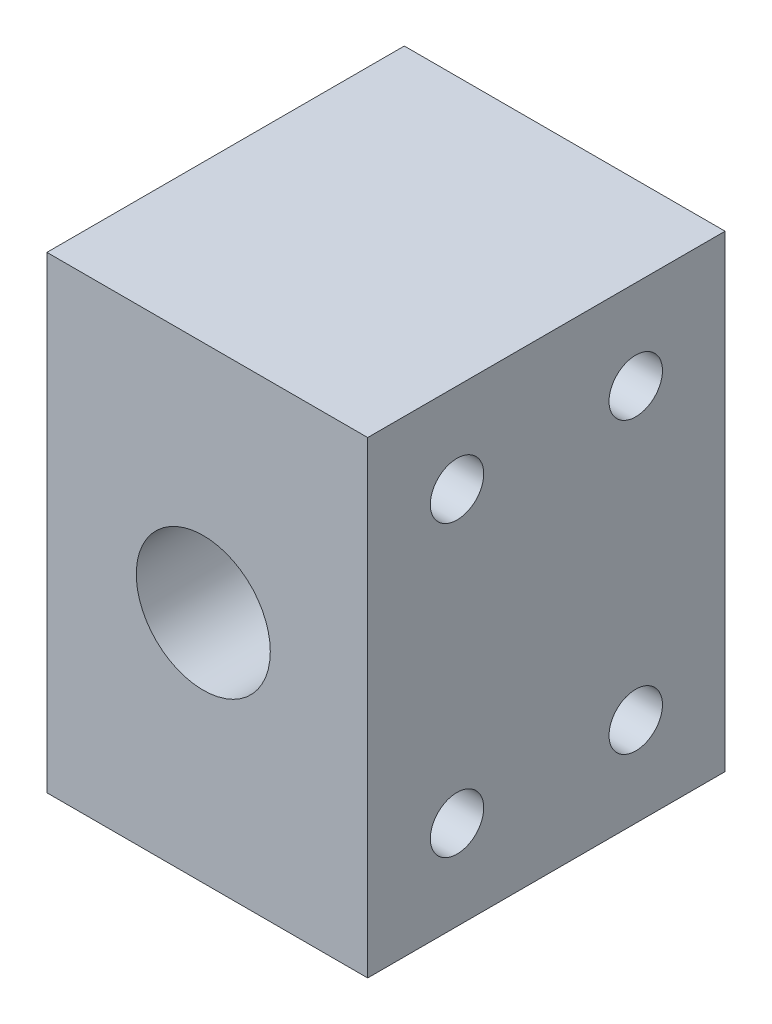
ISO-10303-21;
HEADER;
FILE_DESCRIPTION(('STEP AP214'),'2;1');
FILE_NAME('part.step','',(''),(''),'','','');
FILE_SCHEMA(('AUTOMOTIVE_DESIGN { 1 0 10303 214 1 1 1 1 }'));
ENDSEC;
DATA;
#1=APPLICATION_CONTEXT('core data for automotive mechanical design processes');
#2=APPLICATION_PROTOCOL_DEFINITION('international standard','automotive_design',2000,#1);
#3=PRODUCT_CONTEXT('',#1,'mechanical');
#4=PRODUCT('Part','Part','',(#3));
#5=PRODUCT_RELATED_PRODUCT_CATEGORY('part','',(#4));
#6=PRODUCT_DEFINITION_FORMATION('','',#4);
#7=PRODUCT_DEFINITION_CONTEXT('part definition',#1,'design');
#8=PRODUCT_DEFINITION('design','',#6,#7);
#9=PRODUCT_DEFINITION_SHAPE('','',#8);
#10=(LENGTH_UNIT() NAMED_UNIT(*) SI_UNIT(.MILLI.,.METRE.));
#11=(NAMED_UNIT(*) PLANE_ANGLE_UNIT() SI_UNIT($,.RADIAN.));
#12=(NAMED_UNIT(*) SI_UNIT($,.STERADIAN.) SOLID_ANGLE_UNIT());
#13=UNCERTAINTY_MEASURE_WITH_UNIT(LENGTH_MEASURE(1.E-05),#10,'distance_accuracy_value','');
#14=(GEOMETRIC_REPRESENTATION_CONTEXT(3) GLOBAL_UNCERTAINTY_ASSIGNED_CONTEXT((#13)) GLOBAL_UNIT_ASSIGNED_CONTEXT((#10,
#11,#12)) REPRESENTATION_CONTEXT('',''));
#15=CARTESIAN_POINT('',(0.,0.,0.));
#16=DIRECTION('',(0.,0.,1.));
#17=DIRECTION('',(1.,0.,0.));
#18=AXIS2_PLACEMENT_3D('',#15,#16,#17);
#19=CARTESIAN_POINT('',(0.,0.,25.4));
#20=DIRECTION('',(0.,0.,-1.));
#21=DIRECTION('',(-1.,0.,0.));
#22=AXIS2_PLACEMENT_3D('',#19,#20,#21);
#23=PLANE('',#22);
#24=DIRECTION('',(0.,-1.,0.));
#25=VECTOR('',#24,1.);
#26=CARTESIAN_POINT('',(0.,0.,25.4));
#27=LINE('',#26,#25);
#28=CARTESIAN_POINT('',(0.,33.2637967141949,25.4));
#29=VERTEX_POINT('',#28);
#30=CARTESIAN_POINT('',(0.,0.,25.4));
#31=VERTEX_POINT('',#30);
#32=EDGE_CURVE('E213',#29,#31,#27,.T.);
#33=ORIENTED_EDGE('',*,*,#32,.T.);
#34=DIRECTION('',(1.,0.,0.));
#35=VECTOR('',#34,1.);
#36=CARTESIAN_POINT('',(0.,0.,25.4));
#37=LINE('',#36,#35);
#38=CARTESIAN_POINT('',(22.7965,0.,25.4));
#39=VERTEX_POINT('',#38);
#40=EDGE_CURVE('E86',#31,#39,#37,.T.);
#41=ORIENTED_EDGE('',*,*,#40,.T.);
#42=DIRECTION('',(0.,1.,0.));
#43=VECTOR('',#42,1.);
#44=CARTESIAN_POINT('',(22.7965,0.,25.4));
#45=LINE('',#44,#43);
#46=CARTESIAN_POINT('',(22.7965,33.2637967141949,25.4));
#47=VERTEX_POINT('',#46);
#48=EDGE_CURVE('E209',#39,#47,#45,.T.);
#49=ORIENTED_EDGE('',*,*,#48,.T.);
#50=DIRECTION('',(-1.,0.,0.));
#51=VECTOR('',#50,1.);
#52=CARTESIAN_POINT('',(0.,33.2637967141949,25.4));
#53=LINE('',#52,#51);
#54=EDGE_CURVE('E55',#47,#29,#53,.T.);
#55=ORIENTED_EDGE('',*,*,#54,.T.);
#56=EDGE_LOOP('',(#33,#41,#49,#55));
#57=FACE_BOUND('',#56,.T.);
#58=CARTESIAN_POINT('',(11.1125,16.6318983570974,25.4));
#59=DIRECTION('',(0.,0.,1.));
#60=DIRECTION('',(1.,0.,0.));
#61=AXIS2_PLACEMENT_3D('',#58,#59,#60);
#62=CIRCLE('',#61,4.7625);
#63=CARTESIAN_POINT('',(15.875,16.6318983570974,25.4));
#64=VERTEX_POINT('',#63);
#65=EDGE_CURVE('E143',#64,#64,#62,.T.);
#66=ORIENTED_EDGE('',*,*,#65,.F.);
#67=EDGE_LOOP('',(#66));
#68=FACE_BOUND('',#67,.T.);
#69=ADVANCED_FACE('F38',(#57,#68),#23,.F.);
#70=CARTESIAN_POINT('',(0.,0.,0.));
#71=DIRECTION('',(0.,0.,-1.));
#72=DIRECTION('',(-1.,0.,0.));
#73=AXIS2_PLACEMENT_3D('',#70,#71,#72);
#74=PLANE('',#73);
#75=DIRECTION('',(0.,-1.,0.));
#76=VECTOR('',#75,1.);
#77=CARTESIAN_POINT('',(0.,0.,0.));
#78=LINE('',#77,#76);
#79=CARTESIAN_POINT('',(0.,33.2637967141949,0.));
#80=VERTEX_POINT('',#79);
#81=CARTESIAN_POINT('',(0.,0.,0.));
#82=VERTEX_POINT('',#81);
#83=EDGE_CURVE('E207',#80,#82,#78,.T.);
#84=ORIENTED_EDGE('',*,*,#83,.F.);
#85=DIRECTION('',(-1.,0.,0.));
#86=VECTOR('',#85,1.);
#87=CARTESIAN_POINT('',(0.,33.2637967141949,0.));
#88=LINE('',#87,#86);
#89=CARTESIAN_POINT('',(22.7965,33.2637967141949,0.));
#90=VERTEX_POINT('',#89);
#91=EDGE_CURVE('E79',#90,#80,#88,.T.);
#92=ORIENTED_EDGE('',*,*,#91,.F.);
#93=DIRECTION('',(0.,1.,0.));
#94=VECTOR('',#93,1.);
#95=CARTESIAN_POINT('',(22.7965,0.,0.));
#96=LINE('',#95,#94);
#97=CARTESIAN_POINT('',(22.7965,0.,0.));
#98=VERTEX_POINT('',#97);
#99=EDGE_CURVE('E73',#98,#90,#96,.T.);
#100=ORIENTED_EDGE('',*,*,#99,.F.);
#101=DIRECTION('',(1.,0.,0.));
#102=VECTOR('',#101,1.);
#103=CARTESIAN_POINT('',(0.,0.,0.));
#104=LINE('',#103,#102);
#105=EDGE_CURVE('E202',#82,#98,#104,.T.);
#106=ORIENTED_EDGE('',*,*,#105,.F.);
#107=EDGE_LOOP('',(#84,#92,#100,#106));
#108=FACE_BOUND('',#107,.T.);
#109=CARTESIAN_POINT('',(11.1125,16.6318983570974,0.));
#110=DIRECTION('',(0.,0.,1.));
#111=DIRECTION('',(1.,0.,0.));
#112=AXIS2_PLACEMENT_3D('',#109,#110,#111);
#113=CIRCLE('',#112,4.7625);
#114=CARTESIAN_POINT('',(15.875,16.6318983570974,0.));
#115=VERTEX_POINT('',#114);
#116=EDGE_CURVE('E142',#115,#115,#113,.T.);
#117=ORIENTED_EDGE('',*,*,#116,.T.);
#118=EDGE_LOOP('',(#117));
#119=FACE_BOUND('',#118,.T.);
#120=ADVANCED_FACE('F181',(#108,#119),#74,.T.);
#121=CARTESIAN_POINT('',(0.,0.,25.4));
#122=DIRECTION('',(1.,0.,0.));
#123=DIRECTION('',(0.,0.,-1.));
#124=AXIS2_PLACEMENT_3D('',#121,#122,#123);
#125=PLANE('',#124);
#126=CARTESIAN_POINT('',(0.,16.6318983570974,12.7));
#127=DIRECTION('',(-1.,0.,0.));
#128=DIRECTION('',(0.,0.,1.));
#129=AXIS2_PLACEMENT_3D('',#126,#127,#128);
#130=CIRCLE('',#129,1.89864999999999);
#131=CARTESIAN_POINT('',(0.,16.6318983570974,14.59865));
#132=VERTEX_POINT('',#131);
#133=EDGE_CURVE('E132',#132,#132,#130,.T.);
#134=ORIENTED_EDGE('',*,*,#133,.F.);
#135=EDGE_LOOP('',(#134));
#136=FACE_BOUND('',#135,.T.);
#137=ORIENTED_EDGE('',*,*,#83,.T.);
#138=DIRECTION('',(0.,0.,-1.));
#139=VECTOR('',#138,1.);
#140=CARTESIAN_POINT('',(0.,0.,25.4));
#141=LINE('',#140,#139);
#142=EDGE_CURVE('E11',#31,#82,#141,.T.);
#143=ORIENTED_EDGE('',*,*,#142,.F.);
#144=ORIENTED_EDGE('',*,*,#32,.F.);
#145=DIRECTION('',(0.,0.,-1.));
#146=VECTOR('',#145,1.);
#147=CARTESIAN_POINT('',(0.,33.2637967141949,25.4));
#148=LINE('',#147,#146);
#149=EDGE_CURVE('E217',#29,#80,#148,.T.);
#150=ORIENTED_EDGE('',*,*,#149,.T.);
#151=EDGE_LOOP('',(#137,#143,#144,#150));
#152=FACE_BOUND('',#151,.T.);
#153=ADVANCED_FACE('F40',(#136,#152),#125,.F.);
#154=CARTESIAN_POINT('',(0.,0.,25.4));
#155=DIRECTION('',(0.,1.,0.));
#156=DIRECTION('',(0.,0.,1.));
#157=AXIS2_PLACEMENT_3D('',#154,#155,#156);
#158=PLANE('',#157);
#159=ORIENTED_EDGE('',*,*,#105,.T.);
#160=DIRECTION('',(0.,0.,-1.));
#161=VECTOR('',#160,1.);
#162=CARTESIAN_POINT('',(22.7965,0.,25.4));
#163=LINE('',#162,#161);
#164=EDGE_CURVE('E47',#39,#98,#163,.T.);
#165=ORIENTED_EDGE('',*,*,#164,.F.);
#166=ORIENTED_EDGE('',*,*,#40,.F.);
#167=ORIENTED_EDGE('',*,*,#142,.T.);
#168=EDGE_LOOP('',(#159,#165,#166,#167));
#169=FACE_BOUND('',#168,.T.);
#170=ADVANCED_FACE('F195',(#169),#158,.F.);
#171=CARTESIAN_POINT('',(22.7965,0.,25.4));
#172=DIRECTION('',(-1.,0.,0.));
#173=DIRECTION('',(0.,0.,1.));
#174=AXIS2_PLACEMENT_3D('',#171,#172,#173);
#175=PLANE('',#174);
#176=CARTESIAN_POINT('',(22.7965,26.9137967141949,19.05));
#177=DIRECTION('',(1.,0.,0.));
#178=DIRECTION('',(0.,0.,-1.));
#179=AXIS2_PLACEMENT_3D('',#176,#177,#178);
#180=CIRCLE('',#179,1.89864999999999);
#181=CARTESIAN_POINT('',(22.7965,26.9137967141949,17.15135));
#182=VERTEX_POINT('',#181);
#183=EDGE_CURVE('E110',#182,#182,#180,.T.);
#184=ORIENTED_EDGE('',*,*,#183,.F.);
#185=EDGE_LOOP('',(#184));
#186=FACE_BOUND('',#185,.T.);
#187=CARTESIAN_POINT('',(22.7965,26.9137967141949,6.35));
#188=DIRECTION('',(1.,0.,0.));
#189=DIRECTION('',(0.,0.,-1.));
#190=AXIS2_PLACEMENT_3D('',#187,#188,#189);
#191=CIRCLE('',#190,1.89864999999999);
#192=CARTESIAN_POINT('',(22.7965,26.9137967141949,4.45135000000001));
#193=VERTEX_POINT('',#192);
#194=EDGE_CURVE('E109',#193,#193,#191,.T.);
#195=ORIENTED_EDGE('',*,*,#194,.F.);
#196=EDGE_LOOP('',(#195));
#197=FACE_BOUND('',#196,.T.);
#198=CARTESIAN_POINT('',(22.7965,6.35,19.05));
#199=DIRECTION('',(1.,0.,0.));
#200=DIRECTION('',(0.,0.,-1.));
#201=AXIS2_PLACEMENT_3D('',#198,#199,#200);
#202=CIRCLE('',#201,1.89864999999999);
#203=CARTESIAN_POINT('',(22.7965,6.35,17.15135));
#204=VERTEX_POINT('',#203);
#205=EDGE_CURVE('E120',#204,#204,#202,.T.);
#206=ORIENTED_EDGE('',*,*,#205,.F.);
#207=EDGE_LOOP('',(#206));
#208=FACE_BOUND('',#207,.T.);
#209=CARTESIAN_POINT('',(22.7965,6.35,6.35));
#210=DIRECTION('',(1.,0.,0.));
#211=DIRECTION('',(0.,0.,-1.));
#212=AXIS2_PLACEMENT_3D('',#209,#210,#211);
#213=CIRCLE('',#212,1.89864999999999);
#214=CARTESIAN_POINT('',(22.7965,6.35,4.45135000000001));
#215=VERTEX_POINT('',#214);
#216=EDGE_CURVE('E126',#215,#215,#213,.T.);
#217=ORIENTED_EDGE('',*,*,#216,.F.);
#218=EDGE_LOOP('',(#217));
#219=FACE_BOUND('',#218,.T.);
#220=ORIENTED_EDGE('',*,*,#99,.T.);
#221=DIRECTION('',(0.,0.,-1.));
#222=VECTOR('',#221,1.);
#223=CARTESIAN_POINT('',(22.7965,33.2637967141949,25.4));
#224=LINE('',#223,#222);
#225=EDGE_CURVE('E210',#47,#90,#224,.T.);
#226=ORIENTED_EDGE('',*,*,#225,.F.);
#227=ORIENTED_EDGE('',*,*,#48,.F.);
#228=ORIENTED_EDGE('',*,*,#164,.T.);
#229=EDGE_LOOP('',(#220,#226,#227,#228));
#230=FACE_BOUND('',#229,.T.);
#231=ADVANCED_FACE('F193',(#186,#197,#208,#219,#230),#175,.F.);
#232=CARTESIAN_POINT('',(0.,33.2637967141949,25.4));
#233=DIRECTION('',(0.,-1.,0.));
#234=DIRECTION('',(0.,0.,-1.));
#235=AXIS2_PLACEMENT_3D('',#232,#233,#234);
#236=PLANE('',#235);
#237=ORIENTED_EDGE('',*,*,#91,.T.);
#238=ORIENTED_EDGE('',*,*,#149,.F.);
#239=ORIENTED_EDGE('',*,*,#54,.F.);
#240=ORIENTED_EDGE('',*,*,#225,.T.);
#241=EDGE_LOOP('',(#237,#238,#239,#240));
#242=FACE_BOUND('',#241,.T.);
#243=ADVANCED_FACE('F190',(#242),#236,.F.);
#244=CARTESIAN_POINT('',(11.1125,16.6318983570974,25.4));
#245=DIRECTION('',(0.,0.,-1.));
#246=DIRECTION('',(-1.,0.,0.));
#247=AXIS2_PLACEMENT_3D('',#244,#245,#246);
#248=CYLINDRICAL_SURFACE('',#247,4.7625);
#249=CARTESIAN_POINT('',(6.35,16.6318983570974,14.59865));
#250=CARTESIAN_POINT('',(6.35000679531981,16.5298256242953,14.5986408015354));
#251=CARTESIAN_POINT('',(6.35332001621337,16.4275745138337,14.5903696425024));
#252=CARTESIAN_POINT('',(6.36625011009654,16.2259532275521,14.557571033375));
#253=CARTESIAN_POINT('',(6.37588417054312,16.1265916804909,14.532999257049));
#254=CARTESIAN_POINT('',(6.40041754384473,15.9339902451184,14.4686339296777));
#255=CARTESIAN_POINT('',(6.41529965593297,15.8407315243492,14.4288900712261));
#256=CARTESIAN_POINT('',(6.448861991966,15.6622896967492,14.3355054089604));
#257=CARTESIAN_POINT('',(6.46754088368354,15.5771037726376,14.2818694778398));
#258=CARTESIAN_POINT('',(6.50778518791928,15.4131120845121,14.1595669570853));
#259=CARTESIAN_POINT('',(6.52943979917229,15.3347340860747,14.0903563414016));
#260=CARTESIAN_POINT('',(6.57278635322964,15.1903362203554,13.9400171985775));
#261=CARTESIAN_POINT('',(6.59447830904458,15.1243223640657,13.8588829086145));
#262=CARTESIAN_POINT('',(6.63650775947961,15.0036575936716,13.6826495607817));
#263=CARTESIAN_POINT('',(6.65674319714939,14.9496368979247,13.5870921591106));
#264=CARTESIAN_POINT('',(6.69217036678477,14.8586259112602,13.3873197101917));
#265=CARTESIAN_POINT('',(6.7073644774048,14.8216275854651,13.283108775052));
#266=CARTESIAN_POINT('',(6.73003165090791,14.7674386428951,13.0739013087224));
#267=CARTESIAN_POINT('',(6.73782218978307,14.7494295339974,12.9691524334466));
#268=CARTESIAN_POINT('',(6.74572085877594,14.7311733765464,12.7578520707582));
#269=CARTESIAN_POINT('',(6.7458327321584,14.7309176734028,12.6513014869987));
#270=CARTESIAN_POINT('',(6.73863241832259,14.7475549858169,12.4472669246486));
#271=CARTESIAN_POINT('',(6.73183232461466,14.7632651118477,12.349664916356));
#272=CARTESIAN_POINT('',(6.71243331338369,14.8094167182047,12.1586186469878));
#273=CARTESIAN_POINT('',(6.69983339147169,14.8398607501315,12.065175109133));
#274=CARTESIAN_POINT('',(6.66997853794237,14.9151940988676,11.8828531471995));
#275=CARTESIAN_POINT('',(6.65263415980959,14.9603645623674,11.7941061889284));
#276=CARTESIAN_POINT('',(6.61526953373682,15.0636712420208,11.6251271556913));
#277=CARTESIAN_POINT('',(6.59524828613616,15.1218123074165,11.5448982819314));
#278=CARTESIAN_POINT('',(6.5529142679631,15.2546548298896,11.3887537884854));
#279=CARTESIAN_POINT('',(6.53054355368161,15.3302847574538,11.3136416823149));
#280=CARTESIAN_POINT('',(6.48733833914154,15.4933068099876,11.1769105810361));
#281=CARTESIAN_POINT('',(6.46650414132475,15.5807012411212,11.1152942377032));
#282=CARTESIAN_POINT('',(6.42820370494631,15.7670380167707,11.0062586947868));
#283=CARTESIAN_POINT('',(6.41081109434348,15.8661723733392,10.9591398904283));
#284=CARTESIAN_POINT('',(6.38190957764249,16.071829595602,10.8825240379876));
#285=CARTESIAN_POINT('',(6.37039770370417,16.1783487035344,10.8530180999243));
#286=CARTESIAN_POINT('',(6.35509459044693,16.3890151206166,10.81408618898));
#287=CARTESIAN_POINT('',(6.35088869855197,16.4929328404233,10.8035802746306));
#288=CARTESIAN_POINT('',(6.3493666335719,16.7011213701629,10.7997602362074));
#289=CARTESIAN_POINT('',(6.35204868929388,16.8053920824399,10.8064416925088));
#290=CARTESIAN_POINT('',(6.36372961671543,17.0064441987747,10.836011155892));
#291=CARTESIAN_POINT('',(6.3724416349754,17.1033522732103,10.8581636026108));
#292=CARTESIAN_POINT('',(6.3950092685942,17.2919876754011,10.9170471345811));
#293=CARTESIAN_POINT('',(6.40886554537373,17.3837143352103,10.9537800945575));
#294=CARTESIAN_POINT('',(6.440901706813,17.5625340941767,11.0419795085857));
#295=CARTESIAN_POINT('',(6.45920070075839,17.6494001613374,11.0938616268677));
#296=CARTESIAN_POINT('',(6.49813621814923,17.8134977385189,11.2104250027076));
#297=CARTESIAN_POINT('',(6.51877367340779,17.8907253819496,11.2751113701326));
#298=CARTESIAN_POINT('',(6.56181547138519,18.038666848221,11.4204236447556));
#299=CARTESIAN_POINT('',(6.5842469226184,18.1086212224661,11.5018167290977));
#300=CARTESIAN_POINT('',(6.627092522796,18.2340630202553,11.6755859441581));
#301=CARTESIAN_POINT('',(6.6475063481327,18.2895481253995,11.7679638315147));
#302=CARTESIAN_POINT('',(6.6840298338754,18.3848096556099,11.9624370029683));
#303=CARTESIAN_POINT('',(6.70009744824393,18.4244342914458,12.0646150986014));
#304=CARTESIAN_POINT('',(6.72544249206387,18.4856108545395,12.2750266169471));
#305=CARTESIAN_POINT('',(6.7347248870334,18.5071759996708,12.3832555490069));
#306=CARTESIAN_POINT('',(6.74473376626116,18.530363275985,12.5943516664088));
#307=CARTESIAN_POINT('',(6.74602493696256,18.5333020022708,12.6970483733429));
#308=CARTESIAN_POINT('',(6.74138278671852,18.5226057615673,12.9013982897877));
#309=CARTESIAN_POINT('',(6.73545036950355,18.5089728678247,13.0030516282279));
#310=CARTESIAN_POINT('',(6.71752610835862,18.466593015063,13.1983670801302));
#311=CARTESIAN_POINT('',(6.70577973742014,18.4384565679856,13.2921862378584));
#312=CARTESIAN_POINT('',(6.67772232046415,18.3684375395061,13.4738108906078));
#313=CARTESIAN_POINT('',(6.66141001586846,18.3265511674508,13.5616147192135));
#314=CARTESIAN_POINT('',(6.62490370888163,18.227461386709,13.7341694355925));
#315=CARTESIAN_POINT('',(6.6045414203268,18.1695208494245,13.8184608497514));
#316=CARTESIAN_POINT('',(6.56274611374045,18.0410486557988,13.9765375660417));
#317=CARTESIAN_POINT('',(6.5413127782863,17.9705132506285,14.0503197283356));
#318=CARTESIAN_POINT('',(6.49813559763286,17.8134601949209,14.1901448068558));
#319=CARTESIAN_POINT('',(6.47646020961749,17.7262070599907,14.2553863975172));
#320=CARTESIAN_POINT('',(6.43664972725121,17.5411685620067,14.3703164473622));
#321=CARTESIAN_POINT('',(6.4185162844474,17.4433783185022,14.4199976574974));
#322=CARTESIAN_POINT('',(6.38814218703822,17.2418512614782,14.5012265398066));
#323=CARTESIAN_POINT('',(6.37579736698386,17.1382604190613,14.5330969080432));
#324=CARTESIAN_POINT('',(6.35796411861422,16.9267958846899,14.5787046390349));
#325=CARTESIAN_POINT('',(6.35245391283124,16.8189369319366,14.592499604299));
#326=CARTESIAN_POINT('',(6.35021644508197,16.6845394404929,14.5981051419701));
#327=CARTESIAN_POINT('',(6.34999824735941,16.6582248318231,14.5986523724568));
#328=CARTESIAN_POINT('',(6.35,16.6318983570974,14.59865));
#329=B_SPLINE_CURVE_WITH_KNOTS('',3,(#249,#250,#251,#252,#253,#254,#255,#256,#257,#258,#259,
#260,#261,#262,#263,#264,#265,#266,#267,#268,#269,#270,#271,#272,#273,#274,#275,#276,#277,#278,
#279,#280,#281,#282,#283,#284,#285,#286,#287,#288,#289,#290,#291,#292,#293,#294,#295,#296,#297,
#298,#299,#300,#301,#302,#303,#304,#305,#306,#307,#308,#309,#310,#311,#312,#313,#314,#315,#316,
#317,#318,#319,#320,#321,#322,#323,#324,#325,#326,#327,#328),.UNSPECIFIED.,.T.,.F.,(4,2,2,2,2,2,
2,2,2,2,2,2,2,2,2,2,2,2,2,2,2,2,2,2,2,2,2,2,2,2,2,2,2,2,2,2,2,2,2,4),(0.,0.306148253780946,
0.613132447174014,0.919119694629606,1.22499976097993,1.54394122193961,1.86303734032263,
2.19621911645721,2.52924346279921,2.8472399303701,3.16508137706849,3.46097606376102,
3.75692201149442,4.05888581395965,4.36096269959933,4.68622177111352,5.01154469539098,
5.34321379395449,5.67471534280482,5.98669955955124,6.29860355952906,6.59660670766993,
6.89464818470762,7.20179098568954,7.50905660798068,7.83647522984814,8.16394628156538,
8.4944804083155,8.82477240275464,9.13143057243014,9.43805038057874,9.73270580401241,
10.0274425279509,10.3389833366048,10.6506170295979,10.9822641672415,11.3140655789075,
11.639642486308,11.964179304599,12.0431406887436),.UNSPECIFIED.);
#330=CARTESIAN_POINT('',(6.35,16.6318983570974,14.59865));
#331=VERTEX_POINT('',#330);
#332=EDGE_CURVE('E135',#331,#331,#329,.T.);
#333=ORIENTED_EDGE('',*,*,#332,.F.);
#334=EDGE_LOOP('',(#333));
#335=FACE_BOUND('',#334,.T.);
#336=ORIENTED_EDGE('',*,*,#65,.T.);
#337=EDGE_LOOP('',(#336));
#338=FACE_BOUND('',#337,.T.);
#339=ORIENTED_EDGE('',*,*,#116,.F.);
#340=EDGE_LOOP('',(#339));
#341=FACE_BOUND('',#340,.T.);
#342=ADVANCED_FACE('F152',(#335,#338,#341),#248,.F.);
#343=CARTESIAN_POINT('',(0.,16.6318983570974,12.7));
#344=DIRECTION('',(-1.,0.,0.));
#345=DIRECTION('',(0.,0.,1.));
#346=AXIS2_PLACEMENT_3D('',#343,#344,#345);
#347=CYLINDRICAL_SURFACE('',#346,1.89864999999999);
#348=ORIENTED_EDGE('',*,*,#133,.T.);
#349=EDGE_LOOP('',(#348));
#350=FACE_BOUND('',#349,.T.);
#351=ORIENTED_EDGE('',*,*,#332,.T.);
#352=EDGE_LOOP('',(#351));
#353=FACE_BOUND('',#352,.T.);
#354=ADVANCED_FACE('F147',(#350,#353),#347,.F.);
#355=CARTESIAN_POINT('',(9.84250000000001,6.35,6.35));
#356=DIRECTION('',(1.,0.,0.));
#357=DIRECTION('',(0.,0.,-1.));
#358=AXIS2_PLACEMENT_3D('',#355,#356,#357);
#359=CONICAL_SURFACE('',#358,1.89864999999999,1.02974425867665);
#360=CARTESIAN_POINT('',(8.70167598568334,6.35,6.35));
#361=VERTEX_POINT('',#360);
#362=VERTEX_LOOP('',#361);
#363=FACE_BOUND('',#362,.T.);
#364=CARTESIAN_POINT('',(9.84250000000001,6.35,6.35));
#365=DIRECTION('',(1.,0.,0.));
#366=DIRECTION('',(0.,0.,-1.));
#367=AXIS2_PLACEMENT_3D('',#364,#365,#366);
#368=CIRCLE('',#367,1.89864999999999);
#369=CARTESIAN_POINT('',(9.84250000000001,6.35,4.45135000000001));
#370=VERTEX_POINT('',#369);
#371=EDGE_CURVE('E129',#370,#370,#368,.T.);
#372=ORIENTED_EDGE('',*,*,#371,.T.);
#373=EDGE_LOOP('',(#372));
#374=FACE_BOUND('',#373,.T.);
#375=ADVANCED_FACE('F151',(#363,#374),#359,.F.);
#376=CARTESIAN_POINT('',(22.7965,6.35,6.35));
#377=DIRECTION('',(1.,0.,0.));
#378=DIRECTION('',(0.,0.,-1.));
#379=AXIS2_PLACEMENT_3D('',#376,#377,#378);
#380=CYLINDRICAL_SURFACE('',#379,1.89864999999999);
#381=ORIENTED_EDGE('',*,*,#371,.F.);
#382=EDGE_LOOP('',(#381));
#383=FACE_BOUND('',#382,.T.);
#384=ORIENTED_EDGE('',*,*,#216,.T.);
#385=EDGE_LOOP('',(#384));
#386=FACE_BOUND('',#385,.T.);
#387=ADVANCED_FACE('F156',(#383,#386),#380,.F.);
#388=CARTESIAN_POINT('',(9.84250000000001,6.35,19.05));
#389=DIRECTION('',(1.,0.,0.));
#390=DIRECTION('',(0.,0.,-1.));
#391=AXIS2_PLACEMENT_3D('',#388,#389,#390);
#392=CONICAL_SURFACE('',#391,1.89864999999999,1.02974425867665);
#393=CARTESIAN_POINT('',(8.70167598568334,6.35,19.05));
#394=VERTEX_POINT('',#393);
#395=VERTEX_LOOP('',#394);
#396=FACE_BOUND('',#395,.T.);
#397=CARTESIAN_POINT('',(9.84250000000001,6.35,19.05));
#398=DIRECTION('',(1.,0.,0.));
#399=DIRECTION('',(0.,0.,-1.));
#400=AXIS2_PLACEMENT_3D('',#397,#398,#399);
#401=CIRCLE('',#400,1.89864999999999);
#402=CARTESIAN_POINT('',(9.84250000000001,6.35,17.15135));
#403=VERTEX_POINT('',#402);
#404=EDGE_CURVE('E123',#403,#403,#401,.T.);
#405=ORIENTED_EDGE('',*,*,#404,.T.);
#406=EDGE_LOOP('',(#405));
#407=FACE_BOUND('',#406,.T.);
#408=ADVANCED_FACE('F160',(#396,#407),#392,.F.);
#409=CARTESIAN_POINT('',(22.7965,6.35,19.05));
#410=DIRECTION('',(1.,0.,0.));
#411=DIRECTION('',(0.,0.,-1.));
#412=AXIS2_PLACEMENT_3D('',#409,#410,#411);
#413=CYLINDRICAL_SURFACE('',#412,1.89864999999999);
#414=ORIENTED_EDGE('',*,*,#404,.F.);
#415=EDGE_LOOP('',(#414));
#416=FACE_BOUND('',#415,.T.);
#417=ORIENTED_EDGE('',*,*,#205,.T.);
#418=EDGE_LOOP('',(#417));
#419=FACE_BOUND('',#418,.T.);
#420=ADVANCED_FACE('F164',(#416,#419),#413,.F.);
#421=CARTESIAN_POINT('',(9.84250000000001,26.9137967141949,6.35));
#422=DIRECTION('',(1.,0.,0.));
#423=DIRECTION('',(0.,0.,-1.));
#424=AXIS2_PLACEMENT_3D('',#421,#422,#423);
#425=CONICAL_SURFACE('',#424,1.89864999999999,1.02974425867665);
#426=CARTESIAN_POINT('',(8.70167598568334,26.9137967141949,6.35));
#427=VERTEX_POINT('',#426);
#428=VERTEX_LOOP('',#427);
#429=FACE_BOUND('',#428,.T.);
#430=CARTESIAN_POINT('',(9.84250000000001,26.9137967141949,6.35));
#431=DIRECTION('',(1.,0.,0.));
#432=DIRECTION('',(0.,0.,-1.));
#433=AXIS2_PLACEMENT_3D('',#430,#431,#432);
#434=CIRCLE('',#433,1.89864999999999);
#435=CARTESIAN_POINT('',(9.84250000000001,26.9137967141949,4.45135000000001));
#436=VERTEX_POINT('',#435);
#437=EDGE_CURVE('E113',#436,#436,#434,.T.);
#438=ORIENTED_EDGE('',*,*,#437,.T.);
#439=EDGE_LOOP('',(#438));
#440=FACE_BOUND('',#439,.T.);
#441=ADVANCED_FACE('F168',(#429,#440),#425,.F.);
#442=CARTESIAN_POINT('',(22.7965,26.9137967141949,6.35));
#443=DIRECTION('',(1.,0.,0.));
#444=DIRECTION('',(0.,0.,-1.));
#445=AXIS2_PLACEMENT_3D('',#442,#443,#444);
#446=CYLINDRICAL_SURFACE('',#445,1.89864999999999);
#447=ORIENTED_EDGE('',*,*,#437,.F.);
#448=EDGE_LOOP('',(#447));
#449=FACE_BOUND('',#448,.T.);
#450=ORIENTED_EDGE('',*,*,#194,.T.);
#451=EDGE_LOOP('',(#450));
#452=FACE_BOUND('',#451,.T.);
#453=ADVANCED_FACE('F103',(#449,#452),#446,.F.);
#454=CARTESIAN_POINT('',(9.84250000000001,26.9137967141949,19.05));
#455=DIRECTION('',(1.,0.,0.));
#456=DIRECTION('',(0.,0.,-1.));
#457=AXIS2_PLACEMENT_3D('',#454,#455,#456);
#458=CONICAL_SURFACE('',#457,1.89864999999999,1.02974425867665);
#459=CARTESIAN_POINT('',(8.70167598568334,26.9137967141949,19.05));
#460=VERTEX_POINT('',#459);
#461=VERTEX_LOOP('',#460);
#462=FACE_BOUND('',#461,.T.);
#463=CARTESIAN_POINT('',(9.84250000000001,26.9137967141949,19.05));
#464=DIRECTION('',(1.,0.,0.));
#465=DIRECTION('',(0.,0.,-1.));
#466=AXIS2_PLACEMENT_3D('',#463,#464,#465);
#467=CIRCLE('',#466,1.89864999999999);
#468=CARTESIAN_POINT('',(9.84250000000001,26.9137967141949,17.15135));
#469=VERTEX_POINT('',#468);
#470=EDGE_CURVE('E107',#469,#469,#467,.T.);
#471=ORIENTED_EDGE('',*,*,#470,.T.);
#472=EDGE_LOOP('',(#471));
#473=FACE_BOUND('',#472,.T.);
#474=ADVANCED_FACE('F99',(#462,#473),#458,.F.);
#475=CARTESIAN_POINT('',(22.7965,26.9137967141949,19.05));
#476=DIRECTION('',(1.,0.,0.));
#477=DIRECTION('',(0.,0.,-1.));
#478=AXIS2_PLACEMENT_3D('',#475,#476,#477);
#479=CYLINDRICAL_SURFACE('',#478,1.89864999999999);
#480=ORIENTED_EDGE('',*,*,#470,.F.);
#481=EDGE_LOOP('',(#480));
#482=FACE_BOUND('',#481,.T.);
#483=ORIENTED_EDGE('',*,*,#183,.T.);
#484=EDGE_LOOP('',(#483));
#485=FACE_BOUND('',#484,.T.);
#486=ADVANCED_FACE('F102',(#482,#485),#479,.F.);
#487=CLOSED_SHELL('',(#69,#120,#153,#170,#231,#243,#342,#354,#375,#387,#408,#420,#441,#453,#474,#486));
#488=MANIFOLD_SOLID_BREP('B2',#487);
#489=ADVANCED_BREP_SHAPE_REPRESENTATION('',(#18,#488),#14);
#490=SHAPE_DEFINITION_REPRESENTATION(#9,#489);
ENDSEC;
END-ISO-10303-21;
